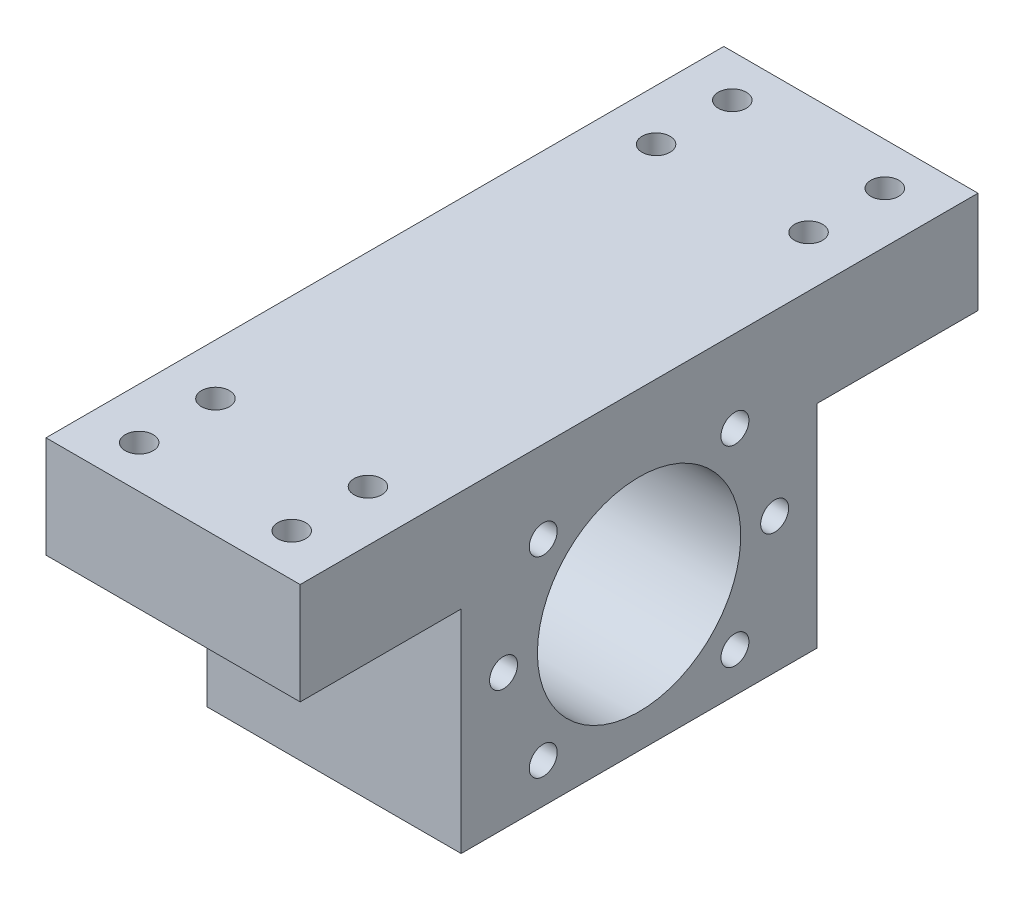
ISO-10303-21;
HEADER;
FILE_DESCRIPTION(('STEP AP214'),'2;1');
FILE_NAME('part.step','',(''),(''),'','','');
FILE_SCHEMA(('AUTOMOTIVE_DESIGN { 1 0 10303 214 1 1 1 1 }'));
ENDSEC;
DATA;
#1=APPLICATION_CONTEXT('core data for automotive mechanical design processes');
#2=APPLICATION_PROTOCOL_DEFINITION('international standard','automotive_design',2000,#1);
#3=PRODUCT_CONTEXT('',#1,'mechanical');
#4=PRODUCT('Part','Part','',(#3));
#5=PRODUCT_RELATED_PRODUCT_CATEGORY('part','',(#4));
#6=PRODUCT_DEFINITION_FORMATION('','',#4);
#7=PRODUCT_DEFINITION_CONTEXT('part definition',#1,'design');
#8=PRODUCT_DEFINITION('design','',#6,#7);
#9=PRODUCT_DEFINITION_SHAPE('','',#8);
#10=(LENGTH_UNIT() NAMED_UNIT(*) SI_UNIT(.MILLI.,.METRE.));
#11=(NAMED_UNIT(*) PLANE_ANGLE_UNIT() SI_UNIT($,.RADIAN.));
#12=(NAMED_UNIT(*) SI_UNIT($,.STERADIAN.) SOLID_ANGLE_UNIT());
#13=UNCERTAINTY_MEASURE_WITH_UNIT(LENGTH_MEASURE(1.E-05),#10,'distance_accuracy_value','');
#14=(GEOMETRIC_REPRESENTATION_CONTEXT(3) GLOBAL_UNCERTAINTY_ASSIGNED_CONTEXT((#13)) GLOBAL_UNIT_ASSIGNED_CONTEXT((#10,
#11,#12)) REPRESENTATION_CONTEXT('',''));
#15=CARTESIAN_POINT('',(0.,0.,0.));
#16=DIRECTION('',(0.,0.,1.));
#17=DIRECTION('',(1.,0.,0.));
#18=AXIS2_PLACEMENT_3D('',#15,#16,#17);
#19=CARTESIAN_POINT('',(30.,41.,40.));
#20=DIRECTION('',(0.,0.,-1.));
#21=DIRECTION('',(0.,1.,0.));
#22=AXIS2_PLACEMENT_3D('',#19,#20,#21);
#23=PLANE('',#22);
#24=DIRECTION('',(0.,-1.,0.));
#25=VECTOR('',#24,1.);
#26=CARTESIAN_POINT('',(0.,41.,40.));
#27=LINE('',#26,#25);
#28=CARTESIAN_POINT('',(0.,41.,40.));
#29=VERTEX_POINT('',#28);
#30=CARTESIAN_POINT('',(0.,29.,40.));
#31=VERTEX_POINT('',#30);
#32=EDGE_CURVE('E106',#29,#31,#27,.T.);
#33=ORIENTED_EDGE('',*,*,#32,.T.);
#34=DIRECTION('',(1.,0.,0.));
#35=VECTOR('',#34,1.);
#36=CARTESIAN_POINT('',(0.,29.,40.));
#37=LINE('',#36,#35);
#38=CARTESIAN_POINT('',(30.,29.,40.));
#39=VERTEX_POINT('',#38);
#40=EDGE_CURVE('E134',#31,#39,#37,.T.);
#41=ORIENTED_EDGE('',*,*,#40,.T.);
#42=DIRECTION('',(0.,-1.,0.));
#43=VECTOR('',#42,1.);
#44=CARTESIAN_POINT('',(30.,41.,40.));
#45=LINE('',#44,#43);
#46=CARTESIAN_POINT('',(30.,41.,40.));
#47=VERTEX_POINT('',#46);
#48=EDGE_CURVE('E100',#47,#39,#45,.T.);
#49=ORIENTED_EDGE('',*,*,#48,.F.);
#50=DIRECTION('',(-1.,0.,0.));
#51=VECTOR('',#50,1.);
#52=CARTESIAN_POINT('',(30.,41.,40.));
#53=LINE('',#52,#51);
#54=EDGE_CURVE('E63',#47,#29,#53,.T.);
#55=ORIENTED_EDGE('',*,*,#54,.T.);
#56=EDGE_LOOP('',(#33,#41,#49,#55));
#57=FACE_BOUND('',#56,.T.);
#58=ADVANCED_FACE('F55',(#57),#23,.F.);
#59=CARTESIAN_POINT('',(30.,41.,-40.));
#60=DIRECTION('',(0.,0.,1.));
#61=DIRECTION('',(0.,-1.,0.));
#62=AXIS2_PLACEMENT_3D('',#59,#60,#61);
#63=PLANE('',#62);
#64=DIRECTION('',(0.,1.,0.));
#65=VECTOR('',#64,1.);
#66=CARTESIAN_POINT('',(30.,41.,-40.));
#67=LINE('',#66,#65);
#68=CARTESIAN_POINT('',(30.,29.,-40.));
#69=VERTEX_POINT('',#68);
#70=CARTESIAN_POINT('',(30.,41.,-40.));
#71=VERTEX_POINT('',#70);
#72=EDGE_CURVE('E127',#69,#71,#67,.T.);
#73=ORIENTED_EDGE('',*,*,#72,.F.);
#74=DIRECTION('',(1.,0.,0.));
#75=VECTOR('',#74,1.);
#76=CARTESIAN_POINT('',(0.,29.,-40.));
#77=LINE('',#76,#75);
#78=CARTESIAN_POINT('',(0.,29.,-40.));
#79=VERTEX_POINT('',#78);
#80=EDGE_CURVE('E136',#79,#69,#77,.T.);
#81=ORIENTED_EDGE('',*,*,#80,.F.);
#82=DIRECTION('',(0.,1.,0.));
#83=VECTOR('',#82,1.);
#84=CARTESIAN_POINT('',(0.,41.,-40.));
#85=LINE('',#84,#83);
#86=CARTESIAN_POINT('',(0.,41.,-40.));
#87=VERTEX_POINT('',#86);
#88=EDGE_CURVE('E101',#79,#87,#85,.T.);
#89=ORIENTED_EDGE('',*,*,#88,.T.);
#90=DIRECTION('',(-1.,0.,0.));
#91=VECTOR('',#90,1.);
#92=CARTESIAN_POINT('',(30.,41.,-40.));
#93=LINE('',#92,#91);
#94=EDGE_CURVE('E13',#71,#87,#93,.T.);
#95=ORIENTED_EDGE('',*,*,#94,.F.);
#96=EDGE_LOOP('',(#73,#81,#89,#95));
#97=FACE_BOUND('',#96,.T.);
#98=ADVANCED_FACE('F369',(#97),#63,.F.);
#99=CARTESIAN_POINT('',(30.,41.,-40.));
#100=DIRECTION('',(0.,-1.,0.));
#101=DIRECTION('',(0.,0.,-1.));
#102=AXIS2_PLACEMENT_3D('',#99,#100,#101);
#103=PLANE('',#102);
#104=CARTESIAN_POINT('',(24.,41.,-35.));
#105=DIRECTION('',(0.,-1.,0.));
#106=DIRECTION('',(0.,0.,-1.));
#107=AXIS2_PLACEMENT_3D('',#104,#105,#106);
#108=CIRCLE('',#107,1.65);
#109=CARTESIAN_POINT('',(24.,41.,-36.65));
#110=VERTEX_POINT('',#109);
#111=EDGE_CURVE('E296',#110,#110,#108,.T.);
#112=ORIENTED_EDGE('',*,*,#111,.T.);
#113=EDGE_LOOP('',(#112));
#114=FACE_BOUND('',#113,.T.);
#115=CARTESIAN_POINT('',(6.,41.,-35.));
#116=DIRECTION('',(0.,-1.,0.));
#117=DIRECTION('',(0.,0.,-1.));
#118=AXIS2_PLACEMENT_3D('',#115,#116,#117);
#119=CIRCLE('',#118,1.65);
#120=CARTESIAN_POINT('',(6.,41.,-36.65));
#121=VERTEX_POINT('',#120);
#122=EDGE_CURVE('E288',#121,#121,#119,.T.);
#123=ORIENTED_EDGE('',*,*,#122,.T.);
#124=EDGE_LOOP('',(#123));
#125=FACE_BOUND('',#124,.T.);
#126=CARTESIAN_POINT('',(6.,41.,-26.));
#127=DIRECTION('',(0.,-1.,0.));
#128=DIRECTION('',(0.,0.,-1.));
#129=AXIS2_PLACEMENT_3D('',#126,#127,#128);
#130=CIRCLE('',#129,1.65);
#131=CARTESIAN_POINT('',(6.,41.,-27.65));
#132=VERTEX_POINT('',#131);
#133=EDGE_CURVE('E280',#132,#132,#130,.T.);
#134=ORIENTED_EDGE('',*,*,#133,.T.);
#135=EDGE_LOOP('',(#134));
#136=FACE_BOUND('',#135,.T.);
#137=CARTESIAN_POINT('',(24.,41.,-26.));
#138=DIRECTION('',(0.,-1.,0.));
#139=DIRECTION('',(0.,0.,-1.));
#140=AXIS2_PLACEMENT_3D('',#137,#138,#139);
#141=CIRCLE('',#140,1.65);
#142=CARTESIAN_POINT('',(24.,41.,-27.65));
#143=VERTEX_POINT('',#142);
#144=EDGE_CURVE('E272',#143,#143,#141,.T.);
#145=ORIENTED_EDGE('',*,*,#144,.T.);
#146=EDGE_LOOP('',(#145));
#147=FACE_BOUND('',#146,.T.);
#148=CARTESIAN_POINT('',(6.,41.,35.));
#149=DIRECTION('',(0.,-1.,0.));
#150=DIRECTION('',(0.,0.,-1.));
#151=AXIS2_PLACEMENT_3D('',#148,#149,#150);
#152=CIRCLE('',#151,1.65);
#153=CARTESIAN_POINT('',(6.,41.,33.35));
#154=VERTEX_POINT('',#153);
#155=EDGE_CURVE('E264',#154,#154,#152,.T.);
#156=ORIENTED_EDGE('',*,*,#155,.T.);
#157=EDGE_LOOP('',(#156));
#158=FACE_BOUND('',#157,.T.);
#159=CARTESIAN_POINT('',(6.,41.,26.));
#160=DIRECTION('',(0.,-1.,0.));
#161=DIRECTION('',(0.,0.,-1.));
#162=AXIS2_PLACEMENT_3D('',#159,#160,#161);
#163=CIRCLE('',#162,1.65);
#164=CARTESIAN_POINT('',(6.,41.,24.35));
#165=VERTEX_POINT('',#164);
#166=EDGE_CURVE('E256',#165,#165,#163,.T.);
#167=ORIENTED_EDGE('',*,*,#166,.T.);
#168=EDGE_LOOP('',(#167));
#169=FACE_BOUND('',#168,.T.);
#170=CARTESIAN_POINT('',(24.,41.,26.));
#171=DIRECTION('',(0.,-1.,0.));
#172=DIRECTION('',(0.,0.,-1.));
#173=AXIS2_PLACEMENT_3D('',#170,#171,#172);
#174=CIRCLE('',#173,1.65);
#175=CARTESIAN_POINT('',(24.,41.,24.35));
#176=VERTEX_POINT('',#175);
#177=EDGE_CURVE('E248',#176,#176,#174,.T.);
#178=ORIENTED_EDGE('',*,*,#177,.T.);
#179=EDGE_LOOP('',(#178));
#180=FACE_BOUND('',#179,.T.);
#181=CARTESIAN_POINT('',(24.,41.,35.));
#182=DIRECTION('',(0.,-1.,0.));
#183=DIRECTION('',(0.,0.,-1.));
#184=AXIS2_PLACEMENT_3D('',#181,#182,#183);
#185=CIRCLE('',#184,1.65);
#186=CARTESIAN_POINT('',(24.,41.,33.35));
#187=VERTEX_POINT('',#186);
#188=EDGE_CURVE('E240',#187,#187,#185,.T.);
#189=ORIENTED_EDGE('',*,*,#188,.T.);
#190=EDGE_LOOP('',(#189));
#191=FACE_BOUND('',#190,.T.);
#192=DIRECTION('',(0.,0.,1.));
#193=VECTOR('',#192,1.);
#194=CARTESIAN_POINT('',(0.,41.,-40.));
#195=LINE('',#194,#193);
#196=EDGE_CURVE('E91',#87,#29,#195,.T.);
#197=ORIENTED_EDGE('',*,*,#196,.T.);
#198=ORIENTED_EDGE('',*,*,#54,.F.);
#199=DIRECTION('',(0.,0.,1.));
#200=VECTOR('',#199,1.);
#201=CARTESIAN_POINT('',(30.,41.,-40.));
#202=LINE('',#201,#200);
#203=EDGE_CURVE('E79',#71,#47,#202,.T.);
#204=ORIENTED_EDGE('',*,*,#203,.F.);
#205=ORIENTED_EDGE('',*,*,#94,.T.);
#206=EDGE_LOOP('',(#197,#198,#204,#205));
#207=FACE_BOUND('',#206,.T.);
#208=ADVANCED_FACE('F93',(#114,#125,#136,#147,#158,#169,#180,#191,#207),#103,.F.);
#209=CARTESIAN_POINT('',(30.,0.,0.));
#210=DIRECTION('',(-1.,0.,0.));
#211=DIRECTION('',(0.,0.,1.));
#212=AXIS2_PLACEMENT_3D('',#209,#210,#211);
#213=PLANE('',#212);
#214=CARTESIAN_POINT('',(30.,31.3137084989848,-11.3137084989847));
#215=DIRECTION('',(-1.,0.,0.));
#216=DIRECTION('',(0.,0.,1.));
#217=AXIS2_PLACEMENT_3D('',#214,#215,#216);
#218=CIRCLE('',#217,1.65);
#219=CARTESIAN_POINT('',(30.,31.3137084989848,-9.66370849898474));
#220=VERTEX_POINT('',#219);
#221=EDGE_CURVE('E232',#220,#220,#218,.T.);
#222=ORIENTED_EDGE('',*,*,#221,.T.);
#223=EDGE_LOOP('',(#222));
#224=FACE_BOUND('',#223,.T.);
#225=CARTESIAN_POINT('',(30.,8.68629150101525,11.3137084989847));
#226=DIRECTION('',(-1.,0.,0.));
#227=DIRECTION('',(0.,0.,1.));
#228=AXIS2_PLACEMENT_3D('',#225,#226,#227);
#229=CIRCLE('',#228,1.65);
#230=CARTESIAN_POINT('',(30.,8.68629150101525,12.9637084989847));
#231=VERTEX_POINT('',#230);
#232=EDGE_CURVE('E224',#231,#231,#229,.T.);
#233=ORIENTED_EDGE('',*,*,#232,.T.);
#234=EDGE_LOOP('',(#233));
#235=FACE_BOUND('',#234,.T.);
#236=CARTESIAN_POINT('',(30.,31.3137084989848,11.3137084989847));
#237=DIRECTION('',(-1.,0.,0.));
#238=DIRECTION('',(0.,0.,1.));
#239=AXIS2_PLACEMENT_3D('',#236,#237,#238);
#240=CIRCLE('',#239,1.65);
#241=CARTESIAN_POINT('',(30.,31.3137084989848,12.9637084989847));
#242=VERTEX_POINT('',#241);
#243=EDGE_CURVE('E216',#242,#242,#240,.T.);
#244=ORIENTED_EDGE('',*,*,#243,.T.);
#245=EDGE_LOOP('',(#244));
#246=FACE_BOUND('',#245,.T.);
#247=CARTESIAN_POINT('',(30.,20.,16.));
#248=DIRECTION('',(-1.,0.,0.));
#249=DIRECTION('',(0.,0.,1.));
#250=AXIS2_PLACEMENT_3D('',#247,#248,#249);
#251=CIRCLE('',#250,1.65);
#252=CARTESIAN_POINT('',(30.,20.,17.65));
#253=VERTEX_POINT('',#252);
#254=EDGE_CURVE('E208',#253,#253,#251,.T.);
#255=ORIENTED_EDGE('',*,*,#254,.T.);
#256=EDGE_LOOP('',(#255));
#257=FACE_BOUND('',#256,.T.);
#258=CARTESIAN_POINT('',(30.,8.68629150101525,-11.3137084989847));
#259=DIRECTION('',(-1.,0.,0.));
#260=DIRECTION('',(0.,0.,1.));
#261=AXIS2_PLACEMENT_3D('',#258,#259,#260);
#262=CIRCLE('',#261,1.65);
#263=CARTESIAN_POINT('',(30.,8.68629150101525,-9.66370849898475));
#264=VERTEX_POINT('',#263);
#265=EDGE_CURVE('E200',#264,#264,#262,.T.);
#266=ORIENTED_EDGE('',*,*,#265,.T.);
#267=EDGE_LOOP('',(#266));
#268=FACE_BOUND('',#267,.T.);
#269=CARTESIAN_POINT('',(30.,20.,-16.));
#270=DIRECTION('',(-1.,0.,0.));
#271=DIRECTION('',(0.,0.,1.));
#272=AXIS2_PLACEMENT_3D('',#269,#270,#271);
#273=CIRCLE('',#272,1.65);
#274=CARTESIAN_POINT('',(30.,20.,-14.35));
#275=VERTEX_POINT('',#274);
#276=EDGE_CURVE('E178',#275,#275,#273,.T.);
#277=ORIENTED_EDGE('',*,*,#276,.T.);
#278=EDGE_LOOP('',(#277));
#279=FACE_BOUND('',#278,.T.);
#280=CARTESIAN_POINT('',(30.,20.,0.));
#281=DIRECTION('',(-1.,0.,0.));
#282=DIRECTION('',(0.,0.,1.));
#283=AXIS2_PLACEMENT_3D('',#280,#281,#282);
#284=CIRCLE('',#283,12.);
#285=CARTESIAN_POINT('',(30.,20.,12.));
#286=VERTEX_POINT('',#285);
#287=EDGE_CURVE('E115',#286,#286,#284,.T.);
#288=ORIENTED_EDGE('',*,*,#287,.T.);
#289=EDGE_LOOP('',(#288));
#290=FACE_BOUND('',#289,.T.);
#291=ORIENTED_EDGE('',*,*,#48,.T.);
#292=DIRECTION('',(0.,0.,1.));
#293=VECTOR('',#292,1.);
#294=CARTESIAN_POINT('',(30.,29.,40.));
#295=LINE('',#294,#293);
#296=CARTESIAN_POINT('',(30.,29.,21.));
#297=VERTEX_POINT('',#296);
#298=EDGE_CURVE('E157',#297,#39,#295,.T.);
#299=ORIENTED_EDGE('',*,*,#298,.F.);
#300=DIRECTION('',(0.,1.,0.));
#301=VECTOR('',#300,1.);
#302=CARTESIAN_POINT('',(30.,29.,21.));
#303=LINE('',#302,#301);
#304=CARTESIAN_POINT('',(30.,4.00000000000001,21.));
#305=VERTEX_POINT('',#304);
#306=EDGE_CURVE('E162',#305,#297,#303,.T.);
#307=ORIENTED_EDGE('',*,*,#306,.F.);
#308=DIRECTION('',(0.,0.,1.));
#309=VECTOR('',#308,1.);
#310=CARTESIAN_POINT('',(30.,4.00000000000001,21.));
#311=LINE('',#310,#309);
#312=CARTESIAN_POINT('',(30.,4.00000000000001,-21.));
#313=VERTEX_POINT('',#312);
#314=EDGE_CURVE('E166',#313,#305,#311,.T.);
#315=ORIENTED_EDGE('',*,*,#314,.F.);
#316=DIRECTION('',(0.,-1.,0.));
#317=VECTOR('',#316,1.);
#318=CARTESIAN_POINT('',(30.,4.00000000000001,-21.));
#319=LINE('',#318,#317);
#320=CARTESIAN_POINT('',(30.,29.,-21.));
#321=VERTEX_POINT('',#320);
#322=EDGE_CURVE('E170',#321,#313,#319,.T.);
#323=ORIENTED_EDGE('',*,*,#322,.F.);
#324=DIRECTION('',(0.,0.,1.));
#325=VECTOR('',#324,1.);
#326=CARTESIAN_POINT('',(30.,29.,-21.));
#327=LINE('',#326,#325);
#328=EDGE_CURVE('E174',#69,#321,#327,.T.);
#329=ORIENTED_EDGE('',*,*,#328,.F.);
#330=ORIENTED_EDGE('',*,*,#72,.T.);
#331=ORIENTED_EDGE('',*,*,#203,.T.);
#332=EDGE_LOOP('',(#291,#299,#307,#315,#323,#329,#330,#331));
#333=FACE_BOUND('',#332,.T.);
#334=ADVANCED_FACE('F330',(#224,#235,#246,#257,#268,#279,#290,#333),#213,.F.);
#335=CARTESIAN_POINT('',(0.,0.,0.));
#336=DIRECTION('',(-1.,0.,0.));
#337=DIRECTION('',(0.,0.,1.));
#338=AXIS2_PLACEMENT_3D('',#335,#336,#337);
#339=PLANE('',#338);
#340=CARTESIAN_POINT('',(0.,31.3137084989848,-11.3137084989847));
#341=DIRECTION('',(-1.,0.,0.));
#342=DIRECTION('',(0.,0.,1.));
#343=AXIS2_PLACEMENT_3D('',#340,#341,#342);
#344=CIRCLE('',#343,1.64999999999998);
#345=CARTESIAN_POINT('',(0.,31.3137084989848,-9.66370849898475));
#346=VERTEX_POINT('',#345);
#347=EDGE_CURVE('E236',#346,#346,#344,.T.);
#348=ORIENTED_EDGE('',*,*,#347,.F.);
#349=EDGE_LOOP('',(#348));
#350=FACE_BOUND('',#349,.T.);
#351=CARTESIAN_POINT('',(0.,8.68629150101525,11.3137084989847));
#352=DIRECTION('',(-1.,0.,0.));
#353=DIRECTION('',(0.,0.,1.));
#354=AXIS2_PLACEMENT_3D('',#351,#352,#353);
#355=CIRCLE('',#354,1.64999999999999);
#356=CARTESIAN_POINT('',(0.,8.68629150101525,12.9637084989847));
#357=VERTEX_POINT('',#356);
#358=EDGE_CURVE('E228',#357,#357,#355,.T.);
#359=ORIENTED_EDGE('',*,*,#358,.F.);
#360=EDGE_LOOP('',(#359));
#361=FACE_BOUND('',#360,.T.);
#362=CARTESIAN_POINT('',(0.,31.3137084989848,11.3137084989847));
#363=DIRECTION('',(-1.,0.,0.));
#364=DIRECTION('',(0.,0.,1.));
#365=AXIS2_PLACEMENT_3D('',#362,#363,#364);
#366=CIRCLE('',#365,1.64999999999998);
#367=CARTESIAN_POINT('',(0.,31.3137084989848,12.9637084989847));
#368=VERTEX_POINT('',#367);
#369=EDGE_CURVE('E220',#368,#368,#366,.T.);
#370=ORIENTED_EDGE('',*,*,#369,.F.);
#371=EDGE_LOOP('',(#370));
#372=FACE_BOUND('',#371,.T.);
#373=CARTESIAN_POINT('',(0.,20.,16.));
#374=DIRECTION('',(-1.,0.,0.));
#375=DIRECTION('',(0.,0.,1.));
#376=AXIS2_PLACEMENT_3D('',#373,#374,#375);
#377=CIRCLE('',#376,1.64999999999999);
#378=CARTESIAN_POINT('',(0.,20.,17.65));
#379=VERTEX_POINT('',#378);
#380=EDGE_CURVE('E212',#379,#379,#377,.T.);
#381=ORIENTED_EDGE('',*,*,#380,.F.);
#382=EDGE_LOOP('',(#381));
#383=FACE_BOUND('',#382,.T.);
#384=CARTESIAN_POINT('',(0.,8.68629150101525,-11.3137084989847));
#385=DIRECTION('',(-1.,0.,0.));
#386=DIRECTION('',(0.,0.,1.));
#387=AXIS2_PLACEMENT_3D('',#384,#385,#386);
#388=CIRCLE('',#387,1.64999999999999);
#389=CARTESIAN_POINT('',(0.,8.68629150101525,-9.66370849898475));
#390=VERTEX_POINT('',#389);
#391=EDGE_CURVE('E204',#390,#390,#388,.T.);
#392=ORIENTED_EDGE('',*,*,#391,.F.);
#393=EDGE_LOOP('',(#392));
#394=FACE_BOUND('',#393,.T.);
#395=CARTESIAN_POINT('',(0.,20.,-16.));
#396=DIRECTION('',(-1.,0.,0.));
#397=DIRECTION('',(0.,0.,1.));
#398=AXIS2_PLACEMENT_3D('',#395,#396,#397);
#399=CIRCLE('',#398,1.64999999999999);
#400=CARTESIAN_POINT('',(0.,20.,-14.35));
#401=VERTEX_POINT('',#400);
#402=EDGE_CURVE('E196',#401,#401,#399,.T.);
#403=ORIENTED_EDGE('',*,*,#402,.F.);
#404=EDGE_LOOP('',(#403));
#405=FACE_BOUND('',#404,.T.);
#406=DIRECTION('',(0.,0.,1.));
#407=VECTOR('',#406,1.);
#408=CARTESIAN_POINT('',(0.,29.,40.));
#409=LINE('',#408,#407);
#410=CARTESIAN_POINT('',(0.,29.,21.));
#411=VERTEX_POINT('',#410);
#412=EDGE_CURVE('E113',#411,#31,#409,.T.);
#413=ORIENTED_EDGE('',*,*,#412,.T.);
#414=ORIENTED_EDGE('',*,*,#32,.F.);
#415=ORIENTED_EDGE('',*,*,#196,.F.);
#416=ORIENTED_EDGE('',*,*,#88,.F.);
#417=DIRECTION('',(0.,0.,1.));
#418=VECTOR('',#417,1.);
#419=CARTESIAN_POINT('',(0.,29.,-21.));
#420=LINE('',#419,#418);
#421=CARTESIAN_POINT('',(0.,29.,-21.));
#422=VERTEX_POINT('',#421);
#423=EDGE_CURVE('E161',#79,#422,#420,.T.);
#424=ORIENTED_EDGE('',*,*,#423,.T.);
#425=DIRECTION('',(0.,-1.,0.));
#426=VECTOR('',#425,1.);
#427=CARTESIAN_POINT('',(0.,4.00000000000001,-21.));
#428=LINE('',#427,#426);
#429=CARTESIAN_POINT('',(0.,4.00000000000001,-21.));
#430=VERTEX_POINT('',#429);
#431=EDGE_CURVE('E70',#422,#430,#428,.T.);
#432=ORIENTED_EDGE('',*,*,#431,.T.);
#433=DIRECTION('',(0.,0.,1.));
#434=VECTOR('',#433,1.);
#435=CARTESIAN_POINT('',(0.,4.00000000000001,21.));
#436=LINE('',#435,#434);
#437=CARTESIAN_POINT('',(0.,4.00000000000001,21.));
#438=VERTEX_POINT('',#437);
#439=EDGE_CURVE('E184',#430,#438,#436,.T.);
#440=ORIENTED_EDGE('',*,*,#439,.T.);
#441=DIRECTION('',(0.,1.,0.));
#442=VECTOR('',#441,1.);
#443=CARTESIAN_POINT('',(0.,29.,21.));
#444=LINE('',#443,#442);
#445=EDGE_CURVE('E181',#438,#411,#444,.T.);
#446=ORIENTED_EDGE('',*,*,#445,.T.);
#447=EDGE_LOOP('',(#413,#414,#415,#416,#424,#432,#440,#446));
#448=FACE_BOUND('',#447,.T.);
#449=CARTESIAN_POINT('',(0.,20.,0.));
#450=DIRECTION('',(-1.,0.,0.));
#451=DIRECTION('',(0.,0.,1.));
#452=AXIS2_PLACEMENT_3D('',#449,#450,#451);
#453=CIRCLE('',#452,12.);
#454=CARTESIAN_POINT('',(0.,20.,12.));
#455=VERTEX_POINT('',#454);
#456=EDGE_CURVE('E122',#455,#455,#453,.T.);
#457=ORIENTED_EDGE('',*,*,#456,.F.);
#458=EDGE_LOOP('',(#457));
#459=FACE_BOUND('',#458,.T.);
#460=ADVANCED_FACE('F109',(#350,#361,#372,#383,#394,#405,#448,#459),#339,.T.);
#461=CARTESIAN_POINT('',(30.,20.,0.));
#462=DIRECTION('',(-1.,0.,0.));
#463=DIRECTION('',(0.,0.,1.));
#464=AXIS2_PLACEMENT_3D('',#461,#462,#463);
#465=CYLINDRICAL_SURFACE('',#464,12.);
#466=ORIENTED_EDGE('',*,*,#287,.F.);
#467=EDGE_LOOP('',(#466));
#468=FACE_BOUND('',#467,.T.);
#469=ORIENTED_EDGE('',*,*,#456,.T.);
#470=EDGE_LOOP('',(#469));
#471=FACE_BOUND('',#470,.T.);
#472=ADVANCED_FACE('F382',(#468,#471),#465,.F.);
#473=CARTESIAN_POINT('',(0.,29.,40.));
#474=DIRECTION('',(0.,1.,0.));
#475=DIRECTION('',(0.,0.,1.));
#476=AXIS2_PLACEMENT_3D('',#473,#474,#475);
#477=PLANE('',#476);
#478=CARTESIAN_POINT('',(6.,29.,35.));
#479=DIRECTION('',(0.,-1.,0.));
#480=DIRECTION('',(0.,0.,-1.));
#481=AXIS2_PLACEMENT_3D('',#478,#479,#480);
#482=CIRCLE('',#481,1.64999999999999);
#483=CARTESIAN_POINT('',(6.,29.,33.35));
#484=VERTEX_POINT('',#483);
#485=EDGE_CURVE('E268',#484,#484,#482,.T.);
#486=ORIENTED_EDGE('',*,*,#485,.F.);
#487=EDGE_LOOP('',(#486));
#488=FACE_BOUND('',#487,.T.);
#489=CARTESIAN_POINT('',(6.,29.,26.));
#490=DIRECTION('',(0.,-1.,0.));
#491=DIRECTION('',(0.,0.,-1.));
#492=AXIS2_PLACEMENT_3D('',#489,#490,#491);
#493=CIRCLE('',#492,1.64999999999999);
#494=CARTESIAN_POINT('',(6.,29.,24.35));
#495=VERTEX_POINT('',#494);
#496=EDGE_CURVE('E260',#495,#495,#493,.T.);
#497=ORIENTED_EDGE('',*,*,#496,.F.);
#498=EDGE_LOOP('',(#497));
#499=FACE_BOUND('',#498,.T.);
#500=CARTESIAN_POINT('',(24.,29.,26.));
#501=DIRECTION('',(0.,-1.,0.));
#502=DIRECTION('',(0.,0.,-1.));
#503=AXIS2_PLACEMENT_3D('',#500,#501,#502);
#504=CIRCLE('',#503,1.64999999999999);
#505=CARTESIAN_POINT('',(24.,29.,24.35));
#506=VERTEX_POINT('',#505);
#507=EDGE_CURVE('E252',#506,#506,#504,.T.);
#508=ORIENTED_EDGE('',*,*,#507,.F.);
#509=EDGE_LOOP('',(#508));
#510=FACE_BOUND('',#509,.T.);
#511=CARTESIAN_POINT('',(24.,29.,35.));
#512=DIRECTION('',(0.,-1.,0.));
#513=DIRECTION('',(0.,0.,-1.));
#514=AXIS2_PLACEMENT_3D('',#511,#512,#513);
#515=CIRCLE('',#514,1.64999999999999);
#516=CARTESIAN_POINT('',(24.,29.,33.35));
#517=VERTEX_POINT('',#516);
#518=EDGE_CURVE('E244',#517,#517,#515,.T.);
#519=ORIENTED_EDGE('',*,*,#518,.F.);
#520=EDGE_LOOP('',(#519));
#521=FACE_BOUND('',#520,.T.);
#522=ORIENTED_EDGE('',*,*,#298,.T.);
#523=ORIENTED_EDGE('',*,*,#40,.F.);
#524=ORIENTED_EDGE('',*,*,#412,.F.);
#525=DIRECTION('',(1.,0.,0.));
#526=VECTOR('',#525,1.);
#527=CARTESIAN_POINT('',(0.,29.,21.));
#528=LINE('',#527,#526);
#529=EDGE_CURVE('E151',#411,#297,#528,.T.);
#530=ORIENTED_EDGE('',*,*,#529,.T.);
#531=EDGE_LOOP('',(#522,#523,#524,#530));
#532=FACE_BOUND('',#531,.T.);
#533=ADVANCED_FACE('F355',(#488,#499,#510,#521,#532),#477,.F.);
#534=CARTESIAN_POINT('',(0.,29.,21.));
#535=DIRECTION('',(0.,0.,-1.));
#536=DIRECTION('',(0.,1.,0.));
#537=AXIS2_PLACEMENT_3D('',#534,#535,#536);
#538=PLANE('',#537);
#539=ORIENTED_EDGE('',*,*,#306,.T.);
#540=ORIENTED_EDGE('',*,*,#529,.F.);
#541=ORIENTED_EDGE('',*,*,#445,.F.);
#542=DIRECTION('',(1.,0.,0.));
#543=VECTOR('',#542,1.);
#544=CARTESIAN_POINT('',(0.,4.00000000000001,21.));
#545=LINE('',#544,#543);
#546=EDGE_CURVE('E147',#438,#305,#545,.T.);
#547=ORIENTED_EDGE('',*,*,#546,.T.);
#548=EDGE_LOOP('',(#539,#540,#541,#547));
#549=FACE_BOUND('',#548,.T.);
#550=ADVANCED_FACE('F357',(#549),#538,.F.);
#551=CARTESIAN_POINT('',(0.,4.00000000000001,21.));
#552=DIRECTION('',(0.,1.,0.));
#553=DIRECTION('',(0.,0.,1.));
#554=AXIS2_PLACEMENT_3D('',#551,#552,#553);
#555=PLANE('',#554);
#556=ORIENTED_EDGE('',*,*,#314,.T.);
#557=ORIENTED_EDGE('',*,*,#546,.F.);
#558=ORIENTED_EDGE('',*,*,#439,.F.);
#559=DIRECTION('',(1.,0.,0.));
#560=VECTOR('',#559,1.);
#561=CARTESIAN_POINT('',(0.,4.00000000000001,-21.));
#562=LINE('',#561,#560);
#563=EDGE_CURVE('E143',#430,#313,#562,.T.);
#564=ORIENTED_EDGE('',*,*,#563,.T.);
#565=EDGE_LOOP('',(#556,#557,#558,#564));
#566=FACE_BOUND('',#565,.T.);
#567=ADVANCED_FACE('F359',(#566),#555,.F.);
#568=CARTESIAN_POINT('',(0.,4.00000000000001,-21.));
#569=DIRECTION('',(0.,0.,1.));
#570=DIRECTION('',(1.,0.,0.));
#571=AXIS2_PLACEMENT_3D('',#568,#569,#570);
#572=PLANE('',#571);
#573=ORIENTED_EDGE('',*,*,#322,.T.);
#574=ORIENTED_EDGE('',*,*,#563,.F.);
#575=ORIENTED_EDGE('',*,*,#431,.F.);
#576=DIRECTION('',(1.,0.,0.));
#577=VECTOR('',#576,1.);
#578=CARTESIAN_POINT('',(0.,29.,-21.));
#579=LINE('',#578,#577);
#580=EDGE_CURVE('E140',#422,#321,#579,.T.);
#581=ORIENTED_EDGE('',*,*,#580,.T.);
#582=EDGE_LOOP('',(#573,#574,#575,#581));
#583=FACE_BOUND('',#582,.T.);
#584=ADVANCED_FACE('F312',(#583),#572,.F.);
#585=CARTESIAN_POINT('',(0.,29.,-21.));
#586=DIRECTION('',(0.,1.,0.));
#587=DIRECTION('',(0.,0.,1.));
#588=AXIS2_PLACEMENT_3D('',#585,#586,#587);
#589=PLANE('',#588);
#590=CARTESIAN_POINT('',(24.,29.,-35.));
#591=DIRECTION('',(0.,-1.,0.));
#592=DIRECTION('',(0.,0.,-1.));
#593=AXIS2_PLACEMENT_3D('',#590,#591,#592);
#594=CIRCLE('',#593,1.64999999999999);
#595=CARTESIAN_POINT('',(24.,29.,-36.65));
#596=VERTEX_POINT('',#595);
#597=EDGE_CURVE('E300',#596,#596,#594,.T.);
#598=ORIENTED_EDGE('',*,*,#597,.F.);
#599=EDGE_LOOP('',(#598));
#600=FACE_BOUND('',#599,.T.);
#601=CARTESIAN_POINT('',(6.,29.,-35.));
#602=DIRECTION('',(0.,-1.,0.));
#603=DIRECTION('',(0.,0.,-1.));
#604=AXIS2_PLACEMENT_3D('',#601,#602,#603);
#605=CIRCLE('',#604,1.64999999999999);
#606=CARTESIAN_POINT('',(6.,29.,-36.65));
#607=VERTEX_POINT('',#606);
#608=EDGE_CURVE('E292',#607,#607,#605,.T.);
#609=ORIENTED_EDGE('',*,*,#608,.F.);
#610=EDGE_LOOP('',(#609));
#611=FACE_BOUND('',#610,.T.);
#612=CARTESIAN_POINT('',(6.,29.,-26.));
#613=DIRECTION('',(0.,-1.,0.));
#614=DIRECTION('',(0.,0.,-1.));
#615=AXIS2_PLACEMENT_3D('',#612,#613,#614);
#616=CIRCLE('',#615,1.64999999999999);
#617=CARTESIAN_POINT('',(6.,29.,-27.65));
#618=VERTEX_POINT('',#617);
#619=EDGE_CURVE('E284',#618,#618,#616,.T.);
#620=ORIENTED_EDGE('',*,*,#619,.F.);
#621=EDGE_LOOP('',(#620));
#622=FACE_BOUND('',#621,.T.);
#623=CARTESIAN_POINT('',(24.,29.,-26.));
#624=DIRECTION('',(0.,-1.,0.));
#625=DIRECTION('',(0.,0.,-1.));
#626=AXIS2_PLACEMENT_3D('',#623,#624,#625);
#627=CIRCLE('',#626,1.64999999999999);
#628=CARTESIAN_POINT('',(24.,29.,-27.65));
#629=VERTEX_POINT('',#628);
#630=EDGE_CURVE('E276',#629,#629,#627,.T.);
#631=ORIENTED_EDGE('',*,*,#630,.F.);
#632=EDGE_LOOP('',(#631));
#633=FACE_BOUND('',#632,.T.);
#634=ORIENTED_EDGE('',*,*,#328,.T.);
#635=ORIENTED_EDGE('',*,*,#580,.F.);
#636=ORIENTED_EDGE('',*,*,#423,.F.);
#637=ORIENTED_EDGE('',*,*,#80,.T.);
#638=EDGE_LOOP('',(#634,#635,#636,#637));
#639=FACE_BOUND('',#638,.T.);
#640=ADVANCED_FACE('F308',(#600,#611,#622,#633,#639),#589,.F.);
#641=CARTESIAN_POINT('',(0.,20.,-16.));
#642=DIRECTION('',(-1.,0.,0.));
#643=DIRECTION('',(0.,0.,1.));
#644=AXIS2_PLACEMENT_3D('',#641,#642,#643);
#645=CYLINDRICAL_SURFACE('',#644,1.64999999999999);
#646=ORIENTED_EDGE('',*,*,#276,.F.);
#647=EDGE_LOOP('',(#646));
#648=FACE_BOUND('',#647,.T.);
#649=ORIENTED_EDGE('',*,*,#402,.T.);
#650=EDGE_LOOP('',(#649));
#651=FACE_BOUND('',#650,.T.);
#652=ADVANCED_FACE('F311',(#648,#651),#645,.F.);
#653=CARTESIAN_POINT('',(0.,8.68629150101525,-11.3137084989847));
#654=DIRECTION('',(-1.,0.,0.));
#655=DIRECTION('',(0.,0.,1.));
#656=AXIS2_PLACEMENT_3D('',#653,#654,#655);
#657=CYLINDRICAL_SURFACE('',#656,1.64999999999999);
#658=ORIENTED_EDGE('',*,*,#265,.F.);
#659=EDGE_LOOP('',(#658));
#660=FACE_BOUND('',#659,.T.);
#661=ORIENTED_EDGE('',*,*,#391,.T.);
#662=EDGE_LOOP('',(#661));
#663=FACE_BOUND('',#662,.T.);
#664=ADVANCED_FACE('F405',(#660,#663),#657,.F.);
#665=CARTESIAN_POINT('',(0.,20.,16.));
#666=DIRECTION('',(-1.,0.,0.));
#667=DIRECTION('',(0.,0.,1.));
#668=AXIS2_PLACEMENT_3D('',#665,#666,#667);
#669=CYLINDRICAL_SURFACE('',#668,1.64999999999999);
#670=ORIENTED_EDGE('',*,*,#254,.F.);
#671=EDGE_LOOP('',(#670));
#672=FACE_BOUND('',#671,.T.);
#673=ORIENTED_EDGE('',*,*,#380,.T.);
#674=EDGE_LOOP('',(#673));
#675=FACE_BOUND('',#674,.T.);
#676=ADVANCED_FACE('F409',(#672,#675),#669,.F.);
#677=CARTESIAN_POINT('',(0.,31.3137084989848,11.3137084989847));
#678=DIRECTION('',(-1.,0.,0.));
#679=DIRECTION('',(0.,0.,1.));
#680=AXIS2_PLACEMENT_3D('',#677,#678,#679);
#681=CYLINDRICAL_SURFACE('',#680,1.64999999999999);
#682=ORIENTED_EDGE('',*,*,#243,.F.);
#683=EDGE_LOOP('',(#682));
#684=FACE_BOUND('',#683,.T.);
#685=ORIENTED_EDGE('',*,*,#369,.T.);
#686=EDGE_LOOP('',(#685));
#687=FACE_BOUND('',#686,.T.);
#688=ADVANCED_FACE('F413',(#684,#687),#681,.F.);
#689=CARTESIAN_POINT('',(0.,8.68629150101525,11.3137084989847));
#690=DIRECTION('',(-1.,0.,0.));
#691=DIRECTION('',(0.,0.,1.));
#692=AXIS2_PLACEMENT_3D('',#689,#690,#691);
#693=CYLINDRICAL_SURFACE('',#692,1.64999999999999);
#694=ORIENTED_EDGE('',*,*,#232,.F.);
#695=EDGE_LOOP('',(#694));
#696=FACE_BOUND('',#695,.T.);
#697=ORIENTED_EDGE('',*,*,#358,.T.);
#698=EDGE_LOOP('',(#697));
#699=FACE_BOUND('',#698,.T.);
#700=ADVANCED_FACE('F417',(#696,#699),#693,.F.);
#701=CARTESIAN_POINT('',(0.,31.3137084989848,-11.3137084989847));
#702=DIRECTION('',(-1.,0.,0.));
#703=DIRECTION('',(0.,0.,1.));
#704=AXIS2_PLACEMENT_3D('',#701,#702,#703);
#705=CYLINDRICAL_SURFACE('',#704,1.64999999999999);
#706=ORIENTED_EDGE('',*,*,#221,.F.);
#707=EDGE_LOOP('',(#706));
#708=FACE_BOUND('',#707,.T.);
#709=ORIENTED_EDGE('',*,*,#347,.T.);
#710=EDGE_LOOP('',(#709));
#711=FACE_BOUND('',#710,.T.);
#712=ADVANCED_FACE('F421',(#708,#711),#705,.F.);
#713=CARTESIAN_POINT('',(24.,29.,35.));
#714=DIRECTION('',(0.,-1.,0.));
#715=DIRECTION('',(0.,0.,-1.));
#716=AXIS2_PLACEMENT_3D('',#713,#714,#715);
#717=CYLINDRICAL_SURFACE('',#716,1.64999999999999);
#718=ORIENTED_EDGE('',*,*,#188,.F.);
#719=EDGE_LOOP('',(#718));
#720=FACE_BOUND('',#719,.T.);
#721=ORIENTED_EDGE('',*,*,#518,.T.);
#722=EDGE_LOOP('',(#721));
#723=FACE_BOUND('',#722,.T.);
#724=ADVANCED_FACE('F425',(#720,#723),#717,.F.);
#725=CARTESIAN_POINT('',(24.,29.,26.));
#726=DIRECTION('',(0.,-1.,0.));
#727=DIRECTION('',(0.,0.,-1.));
#728=AXIS2_PLACEMENT_3D('',#725,#726,#727);
#729=CYLINDRICAL_SURFACE('',#728,1.64999999999999);
#730=ORIENTED_EDGE('',*,*,#177,.F.);
#731=EDGE_LOOP('',(#730));
#732=FACE_BOUND('',#731,.T.);
#733=ORIENTED_EDGE('',*,*,#507,.T.);
#734=EDGE_LOOP('',(#733));
#735=FACE_BOUND('',#734,.T.);
#736=ADVANCED_FACE('F429',(#732,#735),#729,.F.);
#737=CARTESIAN_POINT('',(6.,29.,26.));
#738=DIRECTION('',(0.,-1.,0.));
#739=DIRECTION('',(0.,0.,-1.));
#740=AXIS2_PLACEMENT_3D('',#737,#738,#739);
#741=CYLINDRICAL_SURFACE('',#740,1.64999999999999);
#742=ORIENTED_EDGE('',*,*,#166,.F.);
#743=EDGE_LOOP('',(#742));
#744=FACE_BOUND('',#743,.T.);
#745=ORIENTED_EDGE('',*,*,#496,.T.);
#746=EDGE_LOOP('',(#745));
#747=FACE_BOUND('',#746,.T.);
#748=ADVANCED_FACE('F433',(#744,#747),#741,.F.);
#749=CARTESIAN_POINT('',(6.,29.,35.));
#750=DIRECTION('',(0.,-1.,0.));
#751=DIRECTION('',(0.,0.,-1.));
#752=AXIS2_PLACEMENT_3D('',#749,#750,#751);
#753=CYLINDRICAL_SURFACE('',#752,1.64999999999999);
#754=ORIENTED_EDGE('',*,*,#155,.F.);
#755=EDGE_LOOP('',(#754));
#756=FACE_BOUND('',#755,.T.);
#757=ORIENTED_EDGE('',*,*,#485,.T.);
#758=EDGE_LOOP('',(#757));
#759=FACE_BOUND('',#758,.T.);
#760=ADVANCED_FACE('F437',(#756,#759),#753,.F.);
#761=CARTESIAN_POINT('',(24.,29.,-26.));
#762=DIRECTION('',(0.,-1.,0.));
#763=DIRECTION('',(0.,0.,-1.));
#764=AXIS2_PLACEMENT_3D('',#761,#762,#763);
#765=CYLINDRICAL_SURFACE('',#764,1.64999999999999);
#766=ORIENTED_EDGE('',*,*,#144,.F.);
#767=EDGE_LOOP('',(#766));
#768=FACE_BOUND('',#767,.T.);
#769=ORIENTED_EDGE('',*,*,#630,.T.);
#770=EDGE_LOOP('',(#769));
#771=FACE_BOUND('',#770,.T.);
#772=ADVANCED_FACE('F441',(#768,#771),#765,.F.);
#773=CARTESIAN_POINT('',(6.,29.,-26.));
#774=DIRECTION('',(0.,-1.,0.));
#775=DIRECTION('',(0.,0.,-1.));
#776=AXIS2_PLACEMENT_3D('',#773,#774,#775);
#777=CYLINDRICAL_SURFACE('',#776,1.64999999999999);
#778=ORIENTED_EDGE('',*,*,#133,.F.);
#779=EDGE_LOOP('',(#778));
#780=FACE_BOUND('',#779,.T.);
#781=ORIENTED_EDGE('',*,*,#619,.T.);
#782=EDGE_LOOP('',(#781));
#783=FACE_BOUND('',#782,.T.);
#784=ADVANCED_FACE('F445',(#780,#783),#777,.F.);
#785=CARTESIAN_POINT('',(6.,29.,-35.));
#786=DIRECTION('',(0.,-1.,0.));
#787=DIRECTION('',(0.,0.,-1.));
#788=AXIS2_PLACEMENT_3D('',#785,#786,#787);
#789=CYLINDRICAL_SURFACE('',#788,1.64999999999999);
#790=ORIENTED_EDGE('',*,*,#122,.F.);
#791=EDGE_LOOP('',(#790));
#792=FACE_BOUND('',#791,.T.);
#793=ORIENTED_EDGE('',*,*,#608,.T.);
#794=EDGE_LOOP('',(#793));
#795=FACE_BOUND('',#794,.T.);
#796=ADVANCED_FACE('F449',(#792,#795),#789,.F.);
#797=CARTESIAN_POINT('',(24.,29.,-35.));
#798=DIRECTION('',(0.,-1.,0.));
#799=DIRECTION('',(0.,0.,-1.));
#800=AXIS2_PLACEMENT_3D('',#797,#798,#799);
#801=CYLINDRICAL_SURFACE('',#800,1.64999999999999);
#802=ORIENTED_EDGE('',*,*,#111,.F.);
#803=EDGE_LOOP('',(#802));
#804=FACE_BOUND('',#803,.T.);
#805=ORIENTED_EDGE('',*,*,#597,.T.);
#806=EDGE_LOOP('',(#805));
#807=FACE_BOUND('',#806,.T.);
#808=ADVANCED_FACE('F306',(#804,#807),#801,.F.);
#809=CLOSED_SHELL('',(#58,#98,#208,#334,#460,#472,#533,#550,#567,#584,#640,#652,#664,#676,#688,
#700,#712,#724,#736,#748,#760,#772,#784,#796,#808));
#810=MANIFOLD_SOLID_BREP('B2',#809);
#811=ADVANCED_BREP_SHAPE_REPRESENTATION('',(#18,#810),#14);
#812=SHAPE_DEFINITION_REPRESENTATION(#9,#811);
ENDSEC;
END-ISO-10303-21;
